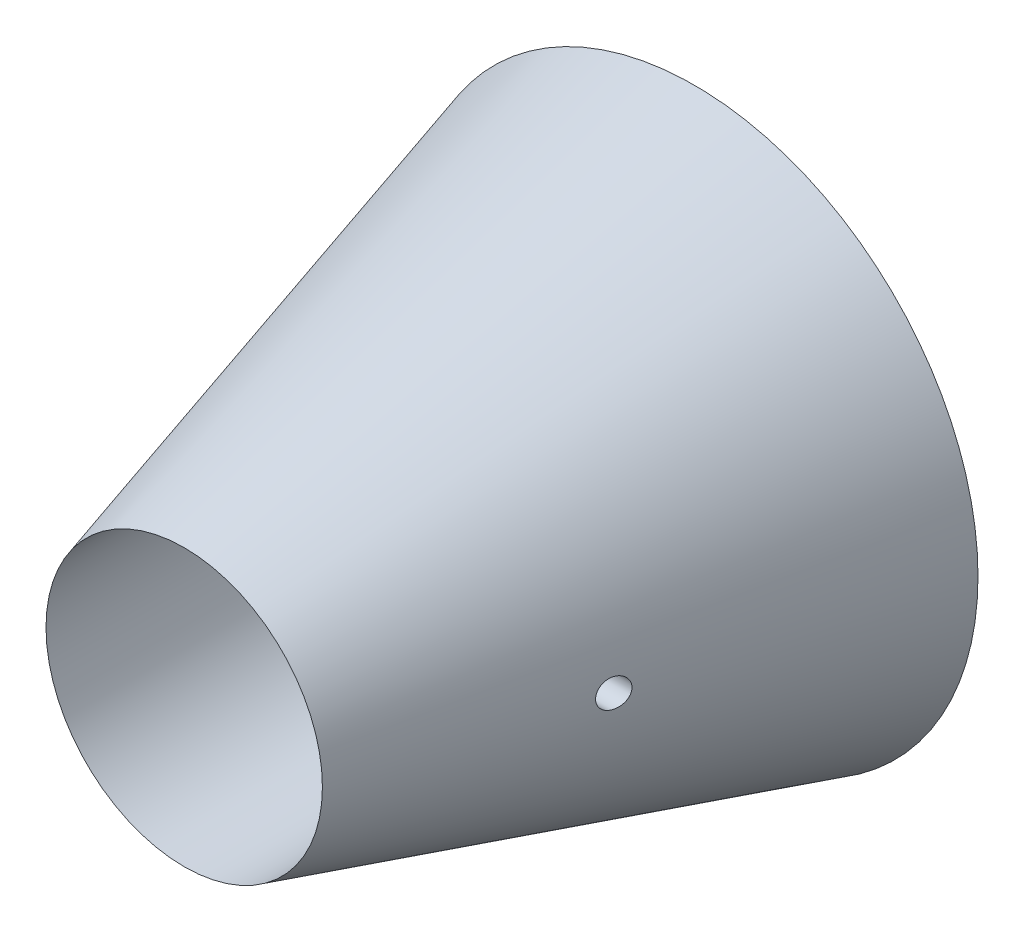
ISO-10303-21;
HEADER;
FILE_DESCRIPTION(('STEP AP214'),'2;1');
FILE_NAME('part.step','',(''),(''),'','','');
FILE_SCHEMA(('AUTOMOTIVE_DESIGN { 1 0 10303 214 1 1 1 1 }'));
ENDSEC;
DATA;
#1=APPLICATION_CONTEXT('core data for automotive mechanical design processes');
#2=APPLICATION_PROTOCOL_DEFINITION('international standard','automotive_design',2000,#1);
#3=PRODUCT_CONTEXT('',#1,'mechanical');
#4=PRODUCT('Part','Part','',(#3));
#5=PRODUCT_RELATED_PRODUCT_CATEGORY('part','',(#4));
#6=PRODUCT_DEFINITION_FORMATION('','',#4);
#7=PRODUCT_DEFINITION_CONTEXT('part definition',#1,'design');
#8=PRODUCT_DEFINITION('design','',#6,#7);
#9=PRODUCT_DEFINITION_SHAPE('','',#8);
#10=(LENGTH_UNIT() NAMED_UNIT(*) SI_UNIT(.MILLI.,.METRE.));
#11=(NAMED_UNIT(*) PLANE_ANGLE_UNIT() SI_UNIT($,.RADIAN.));
#12=(NAMED_UNIT(*) SI_UNIT($,.STERADIAN.) SOLID_ANGLE_UNIT());
#13=UNCERTAINTY_MEASURE_WITH_UNIT(LENGTH_MEASURE(1.E-05),#10,'distance_accuracy_value','');
#14=(GEOMETRIC_REPRESENTATION_CONTEXT(3) GLOBAL_UNCERTAINTY_ASSIGNED_CONTEXT((#13)) GLOBAL_UNIT_ASSIGNED_CONTEXT((#10,
#11,#12)) REPRESENTATION_CONTEXT('',''));
#15=CARTESIAN_POINT('',(0.,0.,0.));
#16=DIRECTION('',(0.,0.,1.));
#17=DIRECTION('',(1.,0.,0.));
#18=AXIS2_PLACEMENT_3D('',#15,#16,#17);
#19=CARTESIAN_POINT('',(0.,0.,180.));
#20=DIRECTION('',(0.,0.,1.));
#21=DIRECTION('',(1.,0.,0.));
#22=AXIS2_PLACEMENT_3D('',#19,#20,#21);
#23=CYLINDRICAL_SURFACE('',#22,48.75);
#24=CARTESIAN_POINT('',(0.,0.,0.));
#25=DIRECTION('',(0.,0.,1.));
#26=DIRECTION('',(1.,0.,0.));
#27=AXIS2_PLACEMENT_3D('',#24,#25,#26);
#28=CIRCLE('',#27,48.75);
#29=CARTESIAN_POINT('',(48.75,0.,0.));
#30=VERTEX_POINT('',#29);
#31=EDGE_CURVE('E10',#30,#30,#28,.T.);
#32=ORIENTED_EDGE('',*,*,#31,.F.);
#33=EDGE_LOOP('',(#32));
#34=FACE_BOUND('',#33,.T.);
#35=CARTESIAN_POINT('',(0.,0.,180.));
#36=DIRECTION('',(0.,0.,1.));
#37=DIRECTION('',(1.,0.,0.));
#38=AXIS2_PLACEMENT_3D('',#35,#36,#37);
#39=CIRCLE('',#38,48.75);
#40=CARTESIAN_POINT('',(48.75,0.,180.));
#41=VERTEX_POINT('',#40);
#42=EDGE_CURVE('E42',#41,#41,#39,.T.);
#43=ORIENTED_EDGE('',*,*,#42,.T.);
#44=EDGE_LOOP('',(#43));
#45=FACE_BOUND('',#44,.T.);
#46=CARTESIAN_POINT('',(48.75,0.,95.));
#47=CARTESIAN_POINT('',(48.750000389197,-0.14008100086284,94.9999986018309));
#48=CARTESIAN_POINT('',(48.7493950083053,-0.280140737873493,95.0058890159541));
#49=CARTESIAN_POINT('',(48.7469912287984,-0.559305925529234,95.0294068089419));
#50=CARTESIAN_POINT('',(48.7451925455075,-0.698411140459885,95.0470369884638));
#51=CARTESIAN_POINT('',(48.7404503592909,-0.974737830645201,95.0939279402502));
#52=CARTESIAN_POINT('',(48.737505949223,-1.11195772382351,95.1231979288691));
#53=CARTESIAN_POINT('',(48.7305544431504,-1.38347878134987,95.1931665631875));
#54=CARTESIAN_POINT('',(48.7265469582316,-1.51777885802131,95.2338693917857));
#55=CARTESIAN_POINT('',(48.7175873522136,-1.7823254585363,95.3263577551216));
#56=CARTESIAN_POINT('',(48.7126361631751,-1.91257583570178,95.3781323607879));
#57=CARTESIAN_POINT('',(48.701923936988,-2.16829177987035,95.4924361395613));
#58=CARTESIAN_POINT('',(48.696162601784,-2.2937555641763,95.5549692726647));
#59=CARTESIAN_POINT('',(48.6839968800058,-2.5388978794622,95.6902913994103));
#60=CARTESIAN_POINT('',(48.6775928619544,-2.65857966824321,95.7630745251197));
#61=CARTESIAN_POINT('',(48.6643161559048,-2.89144274282538,95.9184369559612));
#62=CARTESIAN_POINT('',(48.6574432951223,-3.00462160346189,96.0010198810297));
#63=CARTESIAN_POINT('',(48.6434027571373,-3.22397034323184,96.1756405164407));
#64=CARTESIAN_POINT('',(48.6362342596262,-3.33011824606443,96.2677057671708));
#65=CARTESIAN_POINT('',(48.6218213751467,-3.53432740876358,96.4604728753795));
#66=CARTESIAN_POINT('',(48.614576961105,-3.63238566486568,96.5611779128343));
#67=CARTESIAN_POINT('',(48.600221908122,-3.8196530425597,96.7704550377934));
#68=CARTESIAN_POINT('',(48.5931112269238,-3.90886499881192,96.8790245858134));
#69=CARTESIAN_POINT('',(48.5792198977998,-4.07787800390798,97.1033399806117));
#70=CARTESIAN_POINT('',(48.5724393726231,-4.15767556801212,97.219088460637));
#71=CARTESIAN_POINT('',(48.5593915128267,-4.30739554051586,97.4571373901257));
#72=CARTESIAN_POINT('',(48.55312516295,-4.37729917752714,97.5794497025295));
#73=CARTESIAN_POINT('',(48.5412967585839,-4.50657563732373,97.8296061375659));
#74=CARTESIAN_POINT('',(48.5357349658752,-4.56594454916064,97.9574522927828));
#75=CARTESIAN_POINT('',(48.5254804614672,-4.67366907148744,98.217689519941));
#76=CARTESIAN_POINT('',(48.5207874115692,-4.7220289694427,98.3500787993653));
#77=CARTESIAN_POINT('',(48.5124001208882,-4.80742627588238,98.6185052355794));
#78=CARTESIAN_POINT('',(48.5087062478272,-4.84445951652841,98.7545437151754));
#79=CARTESIAN_POINT('',(48.4993223283529,-4.93785036616057,99.1656124433031));
#80=CARTESIAN_POINT('',(48.4952805494567,-4.97700104155831,99.4448123428154));
#81=CARTESIAN_POINT('',(48.4920997750474,-5.00789044245951,100.005695122123));
#82=CARTESIAN_POINT('',(48.4929606443874,-4.99963047488887,100.287377933261));
#83=CARTESIAN_POINT('',(48.4994651170514,-4.9361304439657,100.84428299938));
#84=CARTESIAN_POINT('',(48.5050904528067,-4.88106981740609,101.119525809727));
#85=CARTESIAN_POINT('',(48.5204637315776,-4.72579415216424,101.65683235715));
#86=CARTESIAN_POINT('',(48.5302117328848,-4.62557847502081,101.918895907822));
#87=CARTESIAN_POINT('',(48.5527523909515,-4.38264425232442,102.422984278809));
#88=CARTESIAN_POINT('',(48.5655507320491,-4.23984622785899,102.664970536143));
#89=CARTESIAN_POINT('',(48.5927454108909,-3.91585672545949,103.12160957111));
#90=CARTESIAN_POINT('',(48.6071417978411,-3.73466406514936,103.336261506646));
#91=CARTESIAN_POINT('',(48.6359918294384,-3.3380272417351,103.733182554229));
#92=CARTESIAN_POINT('',(48.6504454299169,-3.12242809707303,103.915296835475));
#93=CARTESIAN_POINT('',(48.6777183357708,-2.66363602583515,104.24077219106));
#94=CARTESIAN_POINT('',(48.6905376391663,-2.42044306583126,104.384133218452));
#95=CARTESIAN_POINT('',(48.7131020876591,-1.91325834758283,104.628027014304));
#96=CARTESIAN_POINT('',(48.7228466565943,-1.64926270277589,104.728551757082));
#97=CARTESIAN_POINT('',(48.7381578744169,-1.10801780887595,104.883805091289));
#98=CARTESIAN_POINT('',(48.7437246547517,-0.830768977065377,104.938535123583));
#99=CARTESIAN_POINT('',(48.7500361632012,-0.272228441535443,105.00044864221));
#100=CARTESIAN_POINT('',(48.7508025560036,0.00903934777978221,105.007845750611));
#101=CARTESIAN_POINT('',(48.7474850668982,0.568810634624786,104.975444758929));
#102=CARTESIAN_POINT('',(48.7434012539818,0.847314171417597,104.93564733016));
#103=CARTESIAN_POINT('',(48.7308560801636,1.39303341447142,104.81016423428));
#104=CARTESIAN_POINT('',(48.7224042785875,1.66027239745354,104.724578759789));
#105=CARTESIAN_POINT('',(48.7020711161284,2.17660055900645,104.510052035007));
#106=CARTESIAN_POINT('',(48.6901896745848,2.42568931053593,104.381109765012));
#107=CARTESIAN_POINT('',(48.6642718407333,2.8996110877734,104.083001330848));
#108=CARTESIAN_POINT('',(48.6502280017268,3.12435554042963,103.913695015106));
#109=CARTESIAN_POINT('',(48.621584691777,3.54231194552546,103.539864177106));
#110=CARTESIAN_POINT('',(48.606985206158,3.73552306438865,103.335338724132));
#111=CARTESIAN_POINT('',(48.5788106240481,4.08567185517549,102.895946149536));
#112=CARTESIAN_POINT('',(48.5652396221104,4.24246919531283,102.660966909692));
#113=CARTESIAN_POINT('',(48.5407216552142,4.51437295777038,102.167875136452));
#114=CARTESIAN_POINT('',(48.5297746527683,4.62947997570706,101.909762933614));
#115=CARTESIAN_POINT('',(48.511768592767,4.8145067034086,101.378263175584));
#116=CARTESIAN_POINT('',(48.5047023901735,4.88450949714478,101.104904720184));
#117=CARTESIAN_POINT('',(48.4952408395981,4.97759035860086,100.550083631075));
#118=CARTESIAN_POINT('',(48.4928453500628,5.00066984840871,100.268621243232));
#119=CARTESIAN_POINT('',(48.4929473956605,4.99964290141229,99.8474570227359));
#120=CARTESIAN_POINT('',(48.4935928392565,4.99340252271699,99.7074908372863));
#121=CARTESIAN_POINT('',(48.4960784705341,4.96921054801502,99.4285989653847));
#122=CARTESIAN_POINT('',(48.4979182145855,4.95126330058479,99.2896729119443));
#123=CARTESIAN_POINT('',(48.5027427204151,4.90377491789048,99.0137948239799));
#124=CARTESIAN_POINT('',(48.5057279015383,4.87422953645153,98.8768435314916));
#125=CARTESIAN_POINT('',(48.5127559314431,4.80377618536093,98.6059744620394));
#126=CARTESIAN_POINT('',(48.5167983936194,4.76287236869493,98.4720555956482));
#127=CARTESIAN_POINT('',(48.525827445254,4.66998352416419,98.2081206581476));
#128=CARTESIAN_POINT('',(48.5308142285033,4.6179962215002,98.0781053944811));
#129=CARTESIAN_POINT('',(48.5415877348515,4.50334014269483,97.8229651191824));
#130=CARTESIAN_POINT('',(48.5473741657096,4.4406752668614,97.6978383423255));
#131=CARTESIAN_POINT('',(48.5595869146512,4.30507283476307,97.453255580476));
#132=CARTESIAN_POINT('',(48.5660134594491,4.23213163503253,97.3338016269521));
#133=CARTESIAN_POINT('',(48.5793210747985,4.0765372254649,97.1014861820133));
#134=CARTESIAN_POINT('',(48.5862019798918,3.99388754258636,96.9886223186799));
#135=CARTESIAN_POINT('',(48.6002611013155,3.8190116579077,96.7696946920308));
#136=CARTESIAN_POINT('',(48.6074405953638,3.72674104488739,96.6636664823935));
#137=CARTESIAN_POINT('',(48.6218597096454,3.5336420168319,96.4597909416014));
#138=CARTESIAN_POINT('',(48.6290993069958,3.4328167350974,96.3619406409847));
#139=CARTESIAN_POINT('',(48.6434412404114,3.22322228659948,96.1750073996124));
#140=CARTESIAN_POINT('',(48.650543490368,3.1144483284338,96.0859298242102));
#141=CARTESIAN_POINT('',(48.6644030484974,2.88981516863571,95.9172695742775));
#142=CARTESIAN_POINT('',(48.6711604830766,2.77395859816484,95.8376834057625));
#143=CARTESIAN_POINT('',(48.6841620584364,2.53557744063651,95.6883076711548));
#144=CARTESIAN_POINT('',(48.6904045927547,2.41303383009732,95.6185483180658));
#145=CARTESIAN_POINT('',(48.7021740092982,2.16251348650119,95.4896370889704));
#146=CARTESIAN_POINT('',(48.7077011534379,2.03453876476771,95.4304813277677));
#147=CARTESIAN_POINT('',(48.7178810869501,1.77412573229979,95.3232180732733));
#148=CARTESIAN_POINT('',(48.7225345887302,1.64169116318527,95.275101570895));
#149=CARTESIAN_POINT('',(48.7308395507551,1.37324976919271,95.1902179849387));
#150=CARTESIAN_POINT('',(48.734491256199,1.23724382738741,95.1534481238882));
#151=CARTESIAN_POINT('',(48.7416578208933,0.919647422003384,95.0818324431433));
#152=CARTESIAN_POINT('',(48.7447736658721,0.737087728326719,95.0511749660776));
#153=CARTESIAN_POINT('',(48.7489444941515,0.36967301153783,95.0102597116689));
#154=CARTESIAN_POINT('',(48.749999486507,0.184817998514194,95.0000018446957));
#155=CARTESIAN_POINT('',(48.75,0.,95.));
#156=B_SPLINE_CURVE_WITH_KNOTS('',3,(#46,#47,#48,#49,#50,#51,#52,#53,#54,#55,#56,#57,#58,#59,
#60,#61,#62,#63,#64,#65,#66,#67,#68,#69,#70,#71,#72,#73,#74,#75,#76,#77,#78,#79,#80,#81,#82,#83,
#84,#85,#86,#87,#88,#89,#90,#91,#92,#93,#94,#95,#96,#97,#98,#99,#100,#101,#102,#103,#104,#105,
#106,#107,#108,#109,#110,#111,#112,#113,#114,#115,#116,#117,#118,#119,#120,#121,#122,#123,#124,
#125,#126,#127,#128,#129,#130,#131,#132,#133,#134,#135,#136,#137,#138,#139,#140,#141,#142,#143,
#144,#145,#146,#147,#148,#149,#150,#151,#152,#153,#154,#155),.UNSPECIFIED.,.T.,.F.,(4,2,2,2,2,2,
2,2,2,2,2,2,2,2,2,2,2,2,2,2,2,2,2,2,2,2,2,2,2,2,2,2,2,2,2,2,2,2,2,2,2,2,2,2,2,2,2,2,2,2,2,2,2,2,
4),(0.,0.420081372263408,0.840262995736704,1.26077798189679,1.68144702145216,2.1017027151597,
2.52211342872985,2.9422844359281,3.36261113558632,3.78419502857095,4.20593476173172,
4.62753891521351,5.04929863919035,5.47184812352873,5.89455414991491,6.31709527054133,
6.7397916859001,7.58128440501172,8.42275392757352,9.26101167859738,10.0992812823782,
10.939125394758,11.7789953741871,12.62276120516,13.4665280583104,14.3104529277644,
15.1543512433517,15.9944381904937,16.8345131880398,17.6727574216204,18.5110213711709,
19.352239444942,20.1934797525183,21.0379101468124,21.8823284765202,22.7251868695829,
23.5680197180541,23.9879313067028,24.4076870057928,24.8275965245294,25.2473527134102,
25.6671951370627,26.086884528002,26.5067230958436,26.92640961108,27.3481272649718,
27.7696911185456,28.1915112178113,28.6131755538511,29.0361092707313,29.458887704913,
29.8813198745028,30.3036485574235,30.8578917387347,31.4121324848502),.UNSPECIFIED.);
#157=CARTESIAN_POINT('',(48.75,0.,95.));
#158=VERTEX_POINT('',#157);
#159=EDGE_CURVE('E46',#158,#158,#156,.T.);
#160=ORIENTED_EDGE('',*,*,#159,.F.);
#161=EDGE_LOOP('',(#160));
#162=FACE_BOUND('',#161,.T.);
#163=ADVANCED_FACE('F31',(#34,#45,#162),#23,.F.);
#164=CARTESIAN_POINT('',(0.,0.,0.));
#165=DIRECTION('',(0.,0.,-1.));
#166=DIRECTION('',(-1.,0.,0.));
#167=AXIS2_PLACEMENT_3D('',#164,#165,#166);
#168=CONICAL_SURFACE('',#167,100.,0.277382228069845);
#169=ORIENTED_EDGE('',*,*,#42,.F.);
#170=EDGE_LOOP('',(#169));
#171=FACE_BOUND('',#170,.T.);
#172=CARTESIAN_POINT('',(0.,0.,0.));
#173=DIRECTION('',(0.,0.,1.));
#174=DIRECTION('',(1.,0.,0.));
#175=AXIS2_PLACEMENT_3D('',#172,#173,#174);
#176=CIRCLE('',#175,100.);
#177=CARTESIAN_POINT('',(100.,0.,0.));
#178=VERTEX_POINT('',#177);
#179=EDGE_CURVE('E38',#178,#178,#176,.T.);
#180=ORIENTED_EDGE('',*,*,#179,.T.);
#181=EDGE_LOOP('',(#180));
#182=FACE_BOUND('',#181,.T.);
#183=CARTESIAN_POINT('',(72.3344104427794,-3.8482549831851,96.8076758302407));
#184=CARTESIAN_POINT('',(72.297342251452,-3.94164834775744,96.9202568766703));
#185=CARTESIAN_POINT('',(72.2592485186354,-4.02992428732077,97.0367301921056));
#186=CARTESIAN_POINT('',(72.1813937055541,-4.19576304657064,97.276612803554));
#187=CARTESIAN_POINT('',(72.1416320206225,-4.27332193658131,97.4000246205307));
#188=CARTESIAN_POINT('',(72.0607983532004,-4.41732391511411,97.6529889511765));
#189=CARTESIAN_POINT('',(72.0197247208557,-4.48375229382683,97.7825493050856));
#190=CARTESIAN_POINT('',(71.9366874751427,-4.60500455194623,98.0467794058756));
#191=CARTESIAN_POINT('',(71.8947235293899,-4.65982401038557,98.1814510763332));
#192=CARTESIAN_POINT('',(71.8103686893135,-4.75741279563863,98.4546745202502));
#193=CARTESIAN_POINT('',(71.7679786631524,-4.80020288690188,98.5932191480942));
#194=CARTESIAN_POINT('',(71.6830425703146,-4.87360389722578,98.8735097834928));
#195=CARTESIAN_POINT('',(71.6404964522715,-4.90421035942921,99.0152569425555));
#196=CARTESIAN_POINT('',(71.5556370878055,-4.95299191296492,99.3008299442789));
#197=CARTESIAN_POINT('',(71.5133236962707,-4.9711759029638,99.4446542234488));
#198=CARTESIAN_POINT('',(71.4292093060449,-4.99499909619713,99.7335453817654));
#199=CARTESIAN_POINT('',(71.387408501737,-5.00063367835389,99.8786126989048));
#200=CARTESIAN_POINT('',(71.3042269420228,-4.99924637095836,100.170388479454));
#201=CARTESIAN_POINT('',(71.2628546359705,-4.992096655218,100.317098778275));
#202=CARTESIAN_POINT('',(71.1812464410978,-4.96486342249668,100.609694625701));
#203=CARTESIAN_POINT('',(71.1410109865828,-4.94477503053317,100.755579842526));
#204=CARTESIAN_POINT('',(71.0619837935183,-4.89172362367754,101.045334988883));
#205=CARTESIAN_POINT('',(71.0231915682464,-4.8587649931224,101.189205587439));
#206=CARTESIAN_POINT('',(70.947277692855,-4.78009873162702,101.473932805163));
#207=CARTESIAN_POINT('',(70.9101566502287,-4.73438650738603,101.61478831871));
#208=CARTESIAN_POINT('',(70.8384761022673,-4.63137776491862,101.889846695489));
#209=CARTESIAN_POINT('',(70.8038827712761,-4.57430184242394,102.024123336298));
#210=CARTESIAN_POINT('',(70.7367302857903,-4.44837775500767,102.287634180933));
#211=CARTESIAN_POINT('',(70.704171893865,-4.37952521262545,102.416866487723));
#212=CARTESIAN_POINT('',(70.6412911699547,-4.23050637862678,102.669129581625));
#213=CARTESIAN_POINT('',(70.6109676873387,-4.15034597163186,102.792163549445));
#214=CARTESIAN_POINT('',(70.5526844415869,-3.97921673684608,103.03108384329));
#215=CARTESIAN_POINT('',(70.5247255285609,-3.88824404986076,103.146967594655));
#216=CARTESIAN_POINT('',(70.4463246807372,-3.60618889102909,103.475137337748));
#217=CARTESIAN_POINT('',(70.3992715685781,-3.40095937748356,103.676379857686));
#218=CARTESIAN_POINT('',(70.3152489826932,-2.95793863259964,104.041418796466));
#219=CARTESIAN_POINT('',(70.2782778142858,-2.72015288376901,104.205221507845));
#220=CARTESIAN_POINT('',(70.2156906935521,-2.22606132138278,104.485867905413));
#221=CARTESIAN_POINT('',(70.1897795202408,-1.97048212587851,104.603923494281));
#222=CARTESIAN_POINT('',(70.1480137800488,-1.44242448422665,104.79565460646));
#223=CARTESIAN_POINT('',(70.1321581387436,-1.16994784697188,104.869334871193));
#224=CARTESIAN_POINT('',(70.1107724199298,-0.620951937919615,104.968993329965));
#225=CARTESIAN_POINT('',(70.1050667858289,-0.344586462373336,104.99578242953));
#226=CARTESIAN_POINT('',(70.1034633176426,0.208791351094806,105.003295512395));
#227=CARTESIAN_POINT('',(70.1075649725617,0.485803654563269,104.984021895731));
#228=CARTESIAN_POINT('',(70.1255044005828,1.03086087074179,104.900295553295));
#229=CARTESIAN_POINT('',(70.1392831859912,1.29894985896373,104.836116560533));
#230=CARTESIAN_POINT('',(70.1764456852173,1.82036799223322,104.66492844216));
#231=CARTESIAN_POINT('',(70.1998293738459,2.07369717598666,104.557919428872));
#232=CARTESIAN_POINT('',(70.2561653777087,2.55966339954795,104.303907197622));
#233=CARTESIAN_POINT('',(70.2891583118976,2.792207008001,104.156734374332));
#234=CARTESIAN_POINT('',(70.3643648313081,3.22914860438056,103.827204289685));
#235=CARTESIAN_POINT('',(70.4065788842213,3.43354516384165,103.644845243749));
#236=CARTESIAN_POINT('',(70.5004157936502,3.81182877766303,103.247510889298));
#237=CARTESIAN_POINT('',(70.5521704768207,3.98521133255176,103.03208672501));
#238=CARTESIAN_POINT('',(70.6638498019861,4.29345353044594,102.577165283322));
#239=CARTESIAN_POINT('',(70.7237753724772,4.42830879001568,102.337665270883));
#240=CARTESIAN_POINT('',(70.8523506862158,4.65953164181777,101.83500842853));
#241=CARTESIAN_POINT('',(70.9211859909914,4.75481352533009,101.571399938312));
#242=CARTESIAN_POINT('',(71.0648159578709,4.89994500487304,101.033525729819));
#243=CARTESIAN_POINT('',(71.1396116046294,4.94978707721087,100.75925825452));
#244=CARTESIAN_POINT('',(71.2958190777194,5.00423327379883,100.19863306801));
#245=CARTESIAN_POINT('',(71.3773656343697,5.00734915348368,99.912168157482));
#246=CARTESIAN_POINT('',(71.5426357939453,4.9649099906913,99.343488122812));
#247=CARTESIAN_POINT('',(71.6263597632022,4.91934670598766,99.0612737265612));
#248=CARTESIAN_POINT('',(71.7954661466697,4.77920742264671,98.5019057464639));
#249=CARTESIAN_POINT('',(71.8808399239317,4.68347711951628,98.2250378664362));
#250=CARTESIAN_POINT('',(72.0482373003637,4.44472929045425,97.6913549367887));
#251=CARTESIAN_POINT('',(72.1302606854711,4.30170874835853,97.4345411675088));
#252=CARTESIAN_POINT('',(72.2875963830451,3.97210775773648,96.9490577729941));
#253=CARTESIAN_POINT('',(72.3629227095252,3.78562137653766,96.7203289765303));
#254=CARTESIAN_POINT('',(72.5037551994354,3.37347508582064,96.2977416438105));
#255=CARTESIAN_POINT('',(72.5692632397583,3.14782268124088,96.1038764415058));
#256=CARTESIAN_POINT('',(72.6850324786803,2.67234662196699,95.7643495157037));
#257=CARTESIAN_POINT('',(72.7357667381791,2.42372076071589,95.6171741957666));
#258=CARTESIAN_POINT('',(72.8224607644825,1.90272003148597,95.3671777334845));
#259=CARTESIAN_POINT('',(72.8584261098979,1.63035417794592,95.2643398429817));
#260=CARTESIAN_POINT('',(72.9120414557822,1.08552523628,95.1115111935793));
#261=CARTESIAN_POINT('',(72.930578019778,0.81386655563779,95.0589595945602));
#262=CARTESIAN_POINT('',(72.9515909053043,0.265023056148882,94.9994108992838));
#263=CARTESIAN_POINT('',(72.9540719831561,-0.0121601017015707,94.9924003118296));
#264=CARTESIAN_POINT('',(72.9430509861399,-0.553556804829854,95.0236094834158));
#265=CARTESIAN_POINT('',(72.9301219187618,-0.817877659292037,95.0602076883691));
#266=CARTESIAN_POINT('',(72.8898928438587,-1.33636548708416,95.1745869136293));
#267=CARTESIAN_POINT('',(72.8625893136336,-1.59052995498896,95.2523780289684));
#268=CARTESIAN_POINT('',(72.7947522728482,-2.08333789019387,95.4469392920846));
#269=CARTESIAN_POINT('',(72.7541385957174,-2.32187652895016,95.5639457317503));
#270=CARTESIAN_POINT('',(72.6616149772138,-2.77568928984393,95.8328674808929));
#271=CARTESIAN_POINT('',(72.6097163611319,-2.99098641475167,95.984747800284));
#272=CARTESIAN_POINT('',(72.5197171840105,-3.31197336959616,96.2509866205535));
#273=CARTESIAN_POINT('',(72.484543458109,-3.42673458962763,96.3556220919958));
#274=CARTESIAN_POINT('',(72.4114298764104,-3.64564464849038,96.5746217655433));
#275=CARTESIAN_POINT('',(72.373490089851,-3.7497937527985,96.6889857241456));
#276=CARTESIAN_POINT('',(72.3344104427794,-3.8482549831851,96.8076758302407));
#277=B_SPLINE_CURVE_WITH_KNOTS('',3,(#183,#184,#185,#186,#187,#188,#189,#190,#191,#192,#193,
#194,#195,#196,#197,#198,#199,#200,#201,#202,#203,#204,#205,#206,#207,#208,#209,#210,#211,#212,
#213,#214,#215,#216,#217,#218,#219,#220,#221,#222,#223,#224,#225,#226,#227,#228,#229,#230,#231,
#232,#233,#234,#235,#236,#237,#238,#239,#240,#241,#242,#243,#244,#245,#246,#247,#248,#249,#250,
#251,#252,#253,#254,#255,#256,#257,#258,#259,#260,#261,#262,#263,#264,#265,#266,#267,#268,#269,
#270,#271,#272,#273,#274,#275,#276),.UNSPECIFIED.,.T.,.F.,(4,2,2,2,2,2,2,2,2,2,2,2,2,2,2,2,2,2,
2,2,2,2,2,2,2,2,2,2,2,2,2,2,2,2,2,2,2,2,2,2,2,2,2,2,2,2,4),(0.,0.452544553034413,
0.905254605063821,1.3585583076147,1.81203433034364,2.26472271223476,2.71757653888203,
3.17010562882543,3.62280132635735,4.08004872639717,4.53746850713826,4.99473260036979,
5.4521615937023,5.9014514034823,6.3509085821425,6.80013271993697,7.24951768220831,
8.1185955546342,8.98752725293938,9.83154140186433,10.6754653534424,11.504645249808,
12.3337819438143,13.1579079489118,13.9820317927357,14.809691119259,15.6373924341043,
16.4775288660685,17.3177608463641,18.1797255612834,19.0418329700292,19.9313424917245,
20.8210026466742,21.7320952823478,22.6432460385807,23.5524429274398,24.4614657892172,
25.3369763577453,26.212155917824,27.0399295745708,27.8674579981418,28.6651519668998,
29.4630415148386,30.2658278661165,31.0678122486272,31.5449254641643,32.0220267411186),.UNSPECIFIED.);
#278=CARTESIAN_POINT('',(72.3344104427794,-3.8482549831851,96.8076758302407));
#279=VERTEX_POINT('',#278);
#280=EDGE_CURVE('E54',#279,#279,#277,.T.);
#281=ORIENTED_EDGE('',*,*,#280,.T.);
#282=EDGE_LOOP('',(#281));
#283=FACE_BOUND('',#282,.T.);
#284=ADVANCED_FACE('F66',(#171,#182,#283),#168,.T.);
#285=CARTESIAN_POINT('',(0.,48.75,0.));
#286=DIRECTION('',(0.,0.,1.));
#287=DIRECTION('',(1.,0.,0.));
#288=AXIS2_PLACEMENT_3D('',#285,#286,#287);
#289=PLANE('',#288);
#290=ORIENTED_EDGE('',*,*,#179,.F.);
#291=EDGE_LOOP('',(#290));
#292=FACE_BOUND('',#291,.T.);
#293=ORIENTED_EDGE('',*,*,#31,.T.);
#294=EDGE_LOOP('',(#293));
#295=FACE_BOUND('',#294,.T.);
#296=ADVANCED_FACE('F61',(#292,#295),#289,.F.);
#297=CARTESIAN_POINT('',(100.001,0.,100.));
#298=DIRECTION('',(-1.,0.,0.));
#299=DIRECTION('',(0.,0.,1.));
#300=AXIS2_PLACEMENT_3D('',#297,#298,#299);
#301=CYLINDRICAL_SURFACE('',#300,5.);
#302=ORIENTED_EDGE('',*,*,#280,.F.);
#303=EDGE_LOOP('',(#302));
#304=FACE_BOUND('',#303,.T.);
#305=ORIENTED_EDGE('',*,*,#159,.T.);
#306=EDGE_LOOP('',(#305));
#307=FACE_BOUND('',#306,.T.);
#308=ADVANCED_FACE('F58',(#304,#307),#301,.F.);
#309=CLOSED_SHELL('',(#163,#284,#296,#308));
#310=MANIFOLD_SOLID_BREP('B2',#309);
#311=ADVANCED_BREP_SHAPE_REPRESENTATION('',(#18,#310),#14);
#312=SHAPE_DEFINITION_REPRESENTATION(#9,#311);
ENDSEC;
END-ISO-10303-21;
